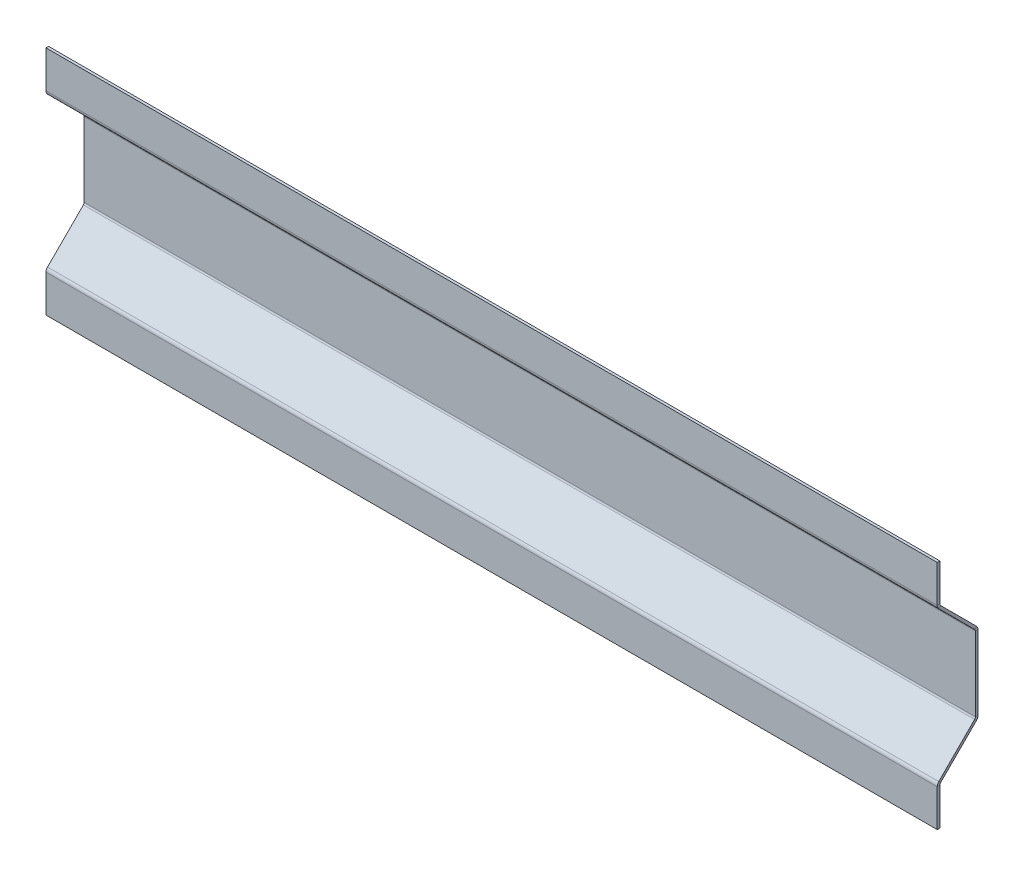
ISO-10303-21;
HEADER;
FILE_DESCRIPTION(('STEP AP214'),'2;1');
FILE_NAME('part.step','',(''),(''),'','','');
FILE_SCHEMA(('AUTOMOTIVE_DESIGN { 1 0 10303 214 1 1 1 1 }'));
ENDSEC;
DATA;
#1=APPLICATION_CONTEXT('core data for automotive mechanical design processes');
#2=APPLICATION_PROTOCOL_DEFINITION('international standard','automotive_design',2000,#1);
#3=PRODUCT_CONTEXT('',#1,'mechanical');
#4=PRODUCT('Part','Part','',(#3));
#5=PRODUCT_RELATED_PRODUCT_CATEGORY('part','',(#4));
#6=PRODUCT_DEFINITION_FORMATION('','',#4);
#7=PRODUCT_DEFINITION_CONTEXT('part definition',#1,'design');
#8=PRODUCT_DEFINITION('design','',#6,#7);
#9=PRODUCT_DEFINITION_SHAPE('','',#8);
#10=(LENGTH_UNIT() NAMED_UNIT(*) SI_UNIT(.MILLI.,.METRE.));
#11=(NAMED_UNIT(*) PLANE_ANGLE_UNIT() SI_UNIT($,.RADIAN.));
#12=(NAMED_UNIT(*) SI_UNIT($,.STERADIAN.) SOLID_ANGLE_UNIT());
#13=UNCERTAINTY_MEASURE_WITH_UNIT(LENGTH_MEASURE(1.E-05),#10,'distance_accuracy_value','');
#14=(GEOMETRIC_REPRESENTATION_CONTEXT(3) GLOBAL_UNCERTAINTY_ASSIGNED_CONTEXT((#13)) GLOBAL_UNIT_ASSIGNED_CONTEXT((#10,
#11,#12)) REPRESENTATION_CONTEXT('',''));
#15=CARTESIAN_POINT('',(0.,0.,0.));
#16=DIRECTION('',(0.,0.,1.));
#17=DIRECTION('',(1.,0.,0.));
#18=AXIS2_PLACEMENT_3D('',#15,#16,#17);
#19=CARTESIAN_POINT('',(170.,-30.5563491861041,14.556349186104));
#20=DIRECTION('',(-1.,0.,0.));
#21=DIRECTION('',(0.,0.,1.));
#22=AXIS2_PLACEMENT_3D('',#19,#20,#21);
#23=PLANE('',#22);
#24=DIRECTION('',(0.,0.707106781186544,0.707106781186551));
#25=VECTOR('',#24,1.);
#26=CARTESIAN_POINT('',(170.,-29.2634559672906,13.2634559672905));
#27=LINE('',#26,#25);
#28=CARTESIAN_POINT('',(170.,-29.2634559672906,13.2634559672905));
#29=VERTEX_POINT('',#28);
#30=CARTESIAN_POINT('',(170.,-28.5563491861041,13.9705627484771));
#31=VERTEX_POINT('',#30);
#32=EDGE_CURVE('E310',#29,#31,#27,.T.);
#33=ORIENTED_EDGE('',*,*,#32,.F.);
#34=DIRECTION('',(0.,-0.707106781186551,0.707106781186544));
#35=VECTOR('',#34,1.);
#36=CARTESIAN_POINT('',(170.,-7.29289321881336,-8.70710678118655));
#37=LINE('',#36,#35);
#38=CARTESIAN_POINT('',(170.,-15.5857864376269,-0.414213562373105));
#39=VERTEX_POINT('',#38);
#40=EDGE_CURVE('E412',#39,#29,#37,.T.);
#41=ORIENTED_EDGE('',*,*,#40,.F.);
#42=DIRECTION('',(0.,0.707106781186544,0.707106781186551));
#43=VECTOR('',#42,1.);
#44=CARTESIAN_POINT('',(170.,-14.8786796564403,0.292893218813448));
#45=LINE('',#44,#43);
#46=CARTESIAN_POINT('',(170.,-14.8786796564403,0.292893218813448));
#47=VERTEX_POINT('',#46);
#48=EDGE_CURVE('E423',#47,#39,#45,.F.);
#49=ORIENTED_EDGE('',*,*,#48,.F.);
#50=DIRECTION('',(0.,0.707106781186551,-0.707106781186544));
#51=VECTOR('',#50,1.);
#52=CARTESIAN_POINT('',(170.,-29.8492424049176,15.2634559672905));
#53=LINE('',#52,#51);
#54=EDGE_CURVE('E417',#47,#31,#53,.F.);
#55=ORIENTED_EDGE('',*,*,#54,.T.);
#56=EDGE_LOOP('',(#33,#41,#49,#55));
#57=FACE_BOUND('',#56,.T.);
#58=ADVANCED_FACE('F114',(#57),#23,.F.);
#59=CARTESIAN_POINT('',(-170.,-15.2928932188134,-0.707106781186551));
#60=DIRECTION('',(1.,0.,0.));
#61=DIRECTION('',(0.,0.,-1.));
#62=AXIS2_PLACEMENT_3D('',#59,#60,#61);
#63=PLANE('',#62);
#64=DIRECTION('',(0.,0.707106781186544,0.707106781186551));
#65=VECTOR('',#64,1.);
#66=CARTESIAN_POINT('',(-170.,-29.2634559672906,13.2634559672905));
#67=LINE('',#66,#65);
#68=CARTESIAN_POINT('',(-170.,-29.2634559672906,13.2634559672905));
#69=VERTEX_POINT('',#68);
#70=CARTESIAN_POINT('',(-170.,-28.5563491861041,13.9705627484771));
#71=VERTEX_POINT('',#70);
#72=EDGE_CURVE('E299',#69,#71,#67,.T.);
#73=ORIENTED_EDGE('',*,*,#72,.T.);
#74=DIRECTION('',(0.,-0.707106781186551,0.707106781186544));
#75=VECTOR('',#74,1.);
#76=CARTESIAN_POINT('',(-170.,-14.5857864376269,0.));
#77=LINE('',#76,#75);
#78=CARTESIAN_POINT('',(-170.,-14.8786796564403,0.292893218813448));
#79=VERTEX_POINT('',#78);
#80=EDGE_CURVE('E415',#71,#79,#77,.F.);
#81=ORIENTED_EDGE('',*,*,#80,.T.);
#82=DIRECTION('',(0.,0.707106781186544,0.707106781186551));
#83=VECTOR('',#82,1.);
#84=CARTESIAN_POINT('',(-170.,-15.5857864376269,-0.414213562373104));
#85=LINE('',#84,#83);
#86=CARTESIAN_POINT('',(-170.,-15.5857864376269,-0.414213562373103));
#87=VERTEX_POINT('',#86);
#88=EDGE_CURVE('E406',#79,#87,#85,.F.);
#89=ORIENTED_EDGE('',*,*,#88,.T.);
#90=DIRECTION('',(0.,0.707106781186551,-0.707106781186544));
#91=VECTOR('',#90,1.);
#92=CARTESIAN_POINT('',(-170.,-7.29289321881336,-8.70710678118655));
#93=LINE('',#92,#91);
#94=EDGE_CURVE('E409',#69,#87,#93,.T.);
#95=ORIENTED_EDGE('',*,*,#94,.F.);
#96=EDGE_LOOP('',(#73,#81,#89,#95));
#97=FACE_BOUND('',#96,.T.);
#98=ADVANCED_FACE('F533',(#97),#63,.F.);
#99=CARTESIAN_POINT('',(0.,-7.29289321881336,-8.70710678118655));
#100=DIRECTION('',(0.,0.707106781186544,0.707106781186551));
#101=DIRECTION('',(0.,-0.707106781186551,0.707106781186544));
#102=AXIS2_PLACEMENT_3D('',#99,#100,#101);
#103=PLANE('',#102);
#104=DIRECTION('',(-1.,0.,0.));
#105=VECTOR('',#104,1.);
#106=CARTESIAN_POINT('',(-170.,-29.2634559672906,13.2634559672905));
#107=LINE('',#106,#105);
#108=EDGE_CURVE('E305',#69,#29,#107,.F.);
#109=ORIENTED_EDGE('',*,*,#108,.F.);
#110=ORIENTED_EDGE('',*,*,#94,.T.);
#111=DIRECTION('',(1.,0.,0.));
#112=VECTOR('',#111,1.);
#113=CARTESIAN_POINT('',(-170.,-15.5857864376269,-0.414213562373104));
#114=LINE('',#113,#112);
#115=EDGE_CURVE('E420',#39,#87,#114,.F.);
#116=ORIENTED_EDGE('',*,*,#115,.F.);
#117=ORIENTED_EDGE('',*,*,#40,.T.);
#118=EDGE_LOOP('',(#109,#110,#116,#117));
#119=FACE_BOUND('',#118,.T.);
#120=ADVANCED_FACE('F487',(#119),#103,.F.);
#121=CARTESIAN_POINT('',(0.,-6.58578643762681,-8.));
#122=DIRECTION('',(0.,0.707106781186544,0.707106781186551));
#123=DIRECTION('',(0.,-0.707106781186551,0.707106781186544));
#124=AXIS2_PLACEMENT_3D('',#121,#122,#123);
#125=PLANE('',#124);
#126=ORIENTED_EDGE('',*,*,#80,.F.);
#127=DIRECTION('',(-1.,0.,0.));
#128=VECTOR('',#127,1.);
#129=CARTESIAN_POINT('',(-170.,-28.5563491861041,13.9705627484771));
#130=LINE('',#129,#128);
#131=EDGE_CURVE('E294',#71,#31,#130,.F.);
#132=ORIENTED_EDGE('',*,*,#131,.T.);
#133=ORIENTED_EDGE('',*,*,#54,.F.);
#134=DIRECTION('',(1.,0.,0.));
#135=VECTOR('',#134,1.);
#136=CARTESIAN_POINT('',(-170.,-14.8786796564403,0.292893218813448));
#137=LINE('',#136,#135);
#138=EDGE_CURVE('E426',#79,#47,#137,.T.);
#139=ORIENTED_EDGE('',*,*,#138,.F.);
#140=EDGE_LOOP('',(#126,#132,#133,#139));
#141=FACE_BOUND('',#140,.T.);
#142=ADVANCED_FACE('F477',(#141),#125,.T.);
#143=CARTESIAN_POINT('',(170.,15.2928932188134,-0.707106781186551));
#144=DIRECTION('',(-1.,0.,0.));
#145=DIRECTION('',(0.,0.,1.));
#146=AXIS2_PLACEMENT_3D('',#143,#144,#145);
#147=PLANE('',#146);
#148=DIRECTION('',(0.,-0.707106781186543,0.707106781186552));
#149=VECTOR('',#148,1.);
#150=CARTESIAN_POINT('',(170.,29.2634559672906,13.2634559672905));
#151=LINE('',#150,#149);
#152=CARTESIAN_POINT('',(170.,29.2634559672906,13.2634559672905));
#153=VERTEX_POINT('',#152);
#154=CARTESIAN_POINT('',(170.,28.5563491861041,13.9705627484771));
#155=VERTEX_POINT('',#154);
#156=EDGE_CURVE('E350',#153,#155,#151,.T.);
#157=ORIENTED_EDGE('',*,*,#156,.T.);
#158=DIRECTION('',(0.,0.707106781186551,0.707106781186544));
#159=VECTOR('',#158,1.);
#160=CARTESIAN_POINT('',(170.,14.5857864376269,0.));
#161=LINE('',#160,#159);
#162=CARTESIAN_POINT('',(170.,14.8786796564404,0.29289321881345));
#163=VERTEX_POINT('',#162);
#164=EDGE_CURVE('E374',#155,#163,#161,.F.);
#165=ORIENTED_EDGE('',*,*,#164,.T.);
#166=DIRECTION('',(0.,-0.707106781186544,0.707106781186551));
#167=VECTOR('',#166,1.);
#168=CARTESIAN_POINT('',(170.,15.5857864376269,-0.414213562373104));
#169=LINE('',#168,#167);
#170=CARTESIAN_POINT('',(170.,15.5857864376269,-0.414213562373102));
#171=VERTEX_POINT('',#170);
#172=EDGE_CURVE('E362',#163,#171,#169,.F.);
#173=ORIENTED_EDGE('',*,*,#172,.T.);
#174=DIRECTION('',(0.,-0.707106781186551,-0.707106781186544));
#175=VECTOR('',#174,1.);
#176=CARTESIAN_POINT('',(170.,7.29289321881336,-8.70710678118655));
#177=LINE('',#176,#175);
#178=EDGE_CURVE('E369',#153,#171,#177,.T.);
#179=ORIENTED_EDGE('',*,*,#178,.F.);
#180=EDGE_LOOP('',(#157,#165,#173,#179));
#181=FACE_BOUND('',#180,.T.);
#182=ADVANCED_FACE('F628',(#181),#147,.F.);
#183=CARTESIAN_POINT('',(-170.,30.5563491861041,14.556349186104));
#184=DIRECTION('',(1.,0.,0.));
#185=DIRECTION('',(0.,0.,-1.));
#186=AXIS2_PLACEMENT_3D('',#183,#184,#185);
#187=PLANE('',#186);
#188=DIRECTION('',(0.,-0.707106781186543,0.707106781186552));
#189=VECTOR('',#188,1.);
#190=CARTESIAN_POINT('',(-170.,29.2634559672906,13.2634559672905));
#191=LINE('',#190,#189);
#192=CARTESIAN_POINT('',(-170.,29.2634559672906,13.2634559672905));
#193=VERTEX_POINT('',#192);
#194=CARTESIAN_POINT('',(-170.,28.5563491861041,13.9705627484771));
#195=VERTEX_POINT('',#194);
#196=EDGE_CURVE('E360',#193,#195,#191,.T.);
#197=ORIENTED_EDGE('',*,*,#196,.F.);
#198=DIRECTION('',(0.,0.707106781186551,0.707106781186544));
#199=VECTOR('',#198,1.);
#200=CARTESIAN_POINT('',(-170.,7.29289321881336,-8.70710678118655));
#201=LINE('',#200,#199);
#202=CARTESIAN_POINT('',(-170.,15.5857864376269,-0.4142135623731));
#203=VERTEX_POINT('',#202);
#204=EDGE_CURVE('E365',#203,#193,#201,.T.);
#205=ORIENTED_EDGE('',*,*,#204,.F.);
#206=DIRECTION('',(0.,-0.707106781186544,0.707106781186551));
#207=VECTOR('',#206,1.);
#208=CARTESIAN_POINT('',(-170.,14.8786796564404,0.292893218813452));
#209=LINE('',#208,#207);
#210=CARTESIAN_POINT('',(-170.,14.8786796564404,0.29289321881345));
#211=VERTEX_POINT('',#210);
#212=EDGE_CURVE('E379',#211,#203,#209,.F.);
#213=ORIENTED_EDGE('',*,*,#212,.F.);
#214=DIRECTION('',(0.,-0.707106781186551,-0.707106781186544));
#215=VECTOR('',#214,1.);
#216=CARTESIAN_POINT('',(-170.,29.8492424049176,15.2634559672905));
#217=LINE('',#216,#215);
#218=EDGE_CURVE('E371',#211,#195,#217,.F.);
#219=ORIENTED_EDGE('',*,*,#218,.T.);
#220=EDGE_LOOP('',(#197,#205,#213,#219));
#221=FACE_BOUND('',#220,.T.);
#222=ADVANCED_FACE('F511',(#221),#187,.F.);
#223=CARTESIAN_POINT('',(0.,7.29289321881336,-8.70710678118655));
#224=DIRECTION('',(0.,-0.707106781186544,0.707106781186551));
#225=DIRECTION('',(0.,-0.707106781186551,-0.707106781186544));
#226=AXIS2_PLACEMENT_3D('',#223,#224,#225);
#227=PLANE('',#226);
#228=DIRECTION('',(1.,0.,0.));
#229=VECTOR('',#228,1.);
#230=CARTESIAN_POINT('',(170.,29.2634559672906,13.2634559672905));
#231=LINE('',#230,#229);
#232=EDGE_CURVE('E356',#153,#193,#231,.F.);
#233=ORIENTED_EDGE('',*,*,#232,.F.);
#234=ORIENTED_EDGE('',*,*,#178,.T.);
#235=DIRECTION('',(-1.,0.,0.));
#236=VECTOR('',#235,1.);
#237=CARTESIAN_POINT('',(170.,15.5857864376269,-0.414213562373104));
#238=LINE('',#237,#236);
#239=EDGE_CURVE('E376',#203,#171,#238,.F.);
#240=ORIENTED_EDGE('',*,*,#239,.F.);
#241=ORIENTED_EDGE('',*,*,#204,.T.);
#242=EDGE_LOOP('',(#233,#234,#240,#241));
#243=FACE_BOUND('',#242,.T.);
#244=ADVANCED_FACE('F518',(#243),#227,.F.);
#245=CARTESIAN_POINT('',(0.,6.58578643762681,-8.));
#246=DIRECTION('',(0.,-0.707106781186544,0.707106781186551));
#247=DIRECTION('',(0.,-0.707106781186551,-0.707106781186544));
#248=AXIS2_PLACEMENT_3D('',#245,#246,#247);
#249=PLANE('',#248);
#250=ORIENTED_EDGE('',*,*,#164,.F.);
#251=DIRECTION('',(1.,0.,0.));
#252=VECTOR('',#251,1.);
#253=CARTESIAN_POINT('',(170.,28.5563491861041,13.9705627484771));
#254=LINE('',#253,#252);
#255=EDGE_CURVE('E345',#155,#195,#254,.F.);
#256=ORIENTED_EDGE('',*,*,#255,.T.);
#257=ORIENTED_EDGE('',*,*,#218,.F.);
#258=DIRECTION('',(-1.,0.,0.));
#259=VECTOR('',#258,1.);
#260=CARTESIAN_POINT('',(170.,14.8786796564403,0.292893218813448));
#261=LINE('',#260,#259);
#262=EDGE_CURVE('E382',#163,#211,#261,.T.);
#263=ORIENTED_EDGE('',*,*,#262,.F.);
#264=EDGE_LOOP('',(#250,#256,#257,#263));
#265=FACE_BOUND('',#264,.T.);
#266=ADVANCED_FACE('F507',(#265),#249,.T.);
#267=CARTESIAN_POINT('',(0.,0.,-1.));
#268=DIRECTION('',(0.,0.,-1.));
#269=DIRECTION('',(-1.,0.,0.));
#270=AXIS2_PLACEMENT_3D('',#267,#268,#269);
#271=PLANE('',#270);
#272=DIRECTION('',(0.,-1.,0.));
#273=VECTOR('',#272,1.);
#274=CARTESIAN_POINT('',(-170.,-16.,-1.));
#275=LINE('',#274,#273);
#276=CARTESIAN_POINT('',(-170.,14.1715728752538,-0.999999999999999));
#277=VERTEX_POINT('',#276);
#278=CARTESIAN_POINT('',(-170.,-14.1715728752538,-1.));
#279=VERTEX_POINT('',#278);
#280=EDGE_CURVE('E13',#277,#279,#275,.T.);
#281=ORIENTED_EDGE('',*,*,#280,.F.);
#282=DIRECTION('',(-1.,0.,0.));
#283=VECTOR('',#282,1.);
#284=CARTESIAN_POINT('',(-170.,14.1715728752538,-0.999999999999999));
#285=LINE('',#284,#283);
#286=CARTESIAN_POINT('',(170.,14.1715728752538,-1.));
#287=VERTEX_POINT('',#286);
#288=EDGE_CURVE('E386',#277,#287,#285,.F.);
#289=ORIENTED_EDGE('',*,*,#288,.T.);
#290=DIRECTION('',(0.,1.,0.));
#291=VECTOR('',#290,1.);
#292=CARTESIAN_POINT('',(170.,-16.,-1.));
#293=LINE('',#292,#291);
#294=CARTESIAN_POINT('',(170.,-14.1715728752538,-1.));
#295=VERTEX_POINT('',#294);
#296=EDGE_CURVE('E123',#295,#287,#293,.T.);
#297=ORIENTED_EDGE('',*,*,#296,.F.);
#298=DIRECTION('',(1.,0.,0.));
#299=VECTOR('',#298,1.);
#300=CARTESIAN_POINT('',(170.,-14.1715728752538,-1.));
#301=LINE('',#300,#299);
#302=EDGE_CURVE('E430',#295,#279,#301,.F.);
#303=ORIENTED_EDGE('',*,*,#302,.T.);
#304=EDGE_LOOP('',(#281,#289,#297,#303));
#305=FACE_BOUND('',#304,.T.);
#306=ADVANCED_FACE('F493',(#305),#271,.T.);
#307=CARTESIAN_POINT('',(0.,0.,0.));
#308=DIRECTION('',(0.,0.,-1.));
#309=DIRECTION('',(-1.,0.,0.));
#310=AXIS2_PLACEMENT_3D('',#307,#308,#309);
#311=PLANE('',#310);
#312=DIRECTION('',(-1.,0.,0.));
#313=VECTOR('',#312,1.);
#314=CARTESIAN_POINT('',(-170.,14.1715728752538,0.));
#315=LINE('',#314,#313);
#316=CARTESIAN_POINT('',(-170.,14.1715728752538,0.));
#317=VERTEX_POINT('',#316);
#318=CARTESIAN_POINT('',(170.,14.1715728752538,0.));
#319=VERTEX_POINT('',#318);
#320=EDGE_CURVE('E399',#317,#319,#315,.F.);
#321=ORIENTED_EDGE('',*,*,#320,.F.);
#322=DIRECTION('',(0.,-1.,0.));
#323=VECTOR('',#322,1.);
#324=CARTESIAN_POINT('',(-170.,-16.,0.));
#325=LINE('',#324,#323);
#326=CARTESIAN_POINT('',(-170.,-14.1715728752538,0.));
#327=VERTEX_POINT('',#326);
#328=EDGE_CURVE('E118',#317,#327,#325,.T.);
#329=ORIENTED_EDGE('',*,*,#328,.T.);
#330=DIRECTION('',(1.,0.,0.));
#331=VECTOR('',#330,1.);
#332=CARTESIAN_POINT('',(170.,-14.1715728752538,0.));
#333=LINE('',#332,#331);
#334=CARTESIAN_POINT('',(170.,-14.1715728752538,0.));
#335=VERTEX_POINT('',#334);
#336=EDGE_CURVE('E443',#335,#327,#333,.F.);
#337=ORIENTED_EDGE('',*,*,#336,.F.);
#338=DIRECTION('',(0.,1.,0.));
#339=VECTOR('',#338,1.);
#340=CARTESIAN_POINT('',(170.,-16.,0.));
#341=LINE('',#340,#339);
#342=EDGE_CURVE('E450',#335,#319,#341,.T.);
#343=ORIENTED_EDGE('',*,*,#342,.T.);
#344=EDGE_LOOP('',(#321,#329,#337,#343));
#345=FACE_BOUND('',#344,.T.);
#346=ADVANCED_FACE('F462',(#345),#311,.F.);
#347=CARTESIAN_POINT('',(-170.,-16.,-1.));
#348=DIRECTION('',(-1.,0.,0.));
#349=DIRECTION('',(0.,0.,1.));
#350=AXIS2_PLACEMENT_3D('',#347,#348,#349);
#351=PLANE('',#350);
#352=ORIENTED_EDGE('',*,*,#328,.F.);
#353=DIRECTION('',(0.,0.,-1.));
#354=VECTOR('',#353,1.);
#355=CARTESIAN_POINT('',(-170.,14.1715728752538,0.));
#356=LINE('',#355,#354);
#357=EDGE_CURVE('E393',#317,#277,#356,.T.);
#358=ORIENTED_EDGE('',*,*,#357,.T.);
#359=ORIENTED_EDGE('',*,*,#280,.T.);
#360=DIRECTION('',(0.,0.,-1.));
#361=VECTOR('',#360,1.);
#362=CARTESIAN_POINT('',(-170.,-14.1715728752538,0.));
#363=LINE('',#362,#361);
#364=EDGE_CURVE('E447',#327,#279,#363,.T.);
#365=ORIENTED_EDGE('',*,*,#364,.F.);
#366=EDGE_LOOP('',(#352,#358,#359,#365));
#367=FACE_BOUND('',#366,.T.);
#368=ADVANCED_FACE('F464',(#367),#351,.T.);
#369=CARTESIAN_POINT('',(170.,-16.,-1.));
#370=DIRECTION('',(1.,0.,0.));
#371=DIRECTION('',(0.,0.,-1.));
#372=AXIS2_PLACEMENT_3D('',#369,#370,#371);
#373=PLANE('',#372);
#374=DIRECTION('',(0.,0.,-1.));
#375=VECTOR('',#374,1.);
#376=CARTESIAN_POINT('',(170.,14.1715728752538,0.));
#377=LINE('',#376,#375);
#378=EDGE_CURVE('E403',#319,#287,#377,.T.);
#379=ORIENTED_EDGE('',*,*,#378,.F.);
#380=ORIENTED_EDGE('',*,*,#342,.F.);
#381=DIRECTION('',(0.,0.,-1.));
#382=VECTOR('',#381,1.);
#383=CARTESIAN_POINT('',(170.,-14.1715728752538,0.));
#384=LINE('',#383,#382);
#385=EDGE_CURVE('E437',#335,#295,#384,.T.);
#386=ORIENTED_EDGE('',*,*,#385,.T.);
#387=ORIENTED_EDGE('',*,*,#296,.T.);
#388=EDGE_LOOP('',(#379,#380,#386,#387));
#389=FACE_BOUND('',#388,.T.);
#390=ADVANCED_FACE('F116',(#389),#373,.T.);
#391=CARTESIAN_POINT('',(-170.,-14.1715728752538,0.999999999999998));
#392=DIRECTION('',(-1.,0.,0.));
#393=DIRECTION('',(0.,0.,1.));
#394=AXIS2_PLACEMENT_3D('',#391,#392,#393);
#395=PLANE('',#394);
#396=ORIENTED_EDGE('',*,*,#88,.F.);
#397=CARTESIAN_POINT('',(-170.,-14.1715728752538,0.999999999999998));
#398=DIRECTION('',(1.,0.,0.));
#399=DIRECTION('',(0.,0.,-1.));
#400=AXIS2_PLACEMENT_3D('',#397,#398,#399);
#401=CIRCLE('',#400,0.999999999999999);
#402=EDGE_CURVE('E440',#327,#79,#401,.F.);
#403=ORIENTED_EDGE('',*,*,#402,.F.);
#404=ORIENTED_EDGE('',*,*,#364,.T.);
#405=CARTESIAN_POINT('',(-170.,-14.1715728752538,0.999999999999998));
#406=DIRECTION('',(1.,0.,0.));
#407=DIRECTION('',(0.,0.,-1.));
#408=AXIS2_PLACEMENT_3D('',#405,#406,#407);
#409=CIRCLE('',#408,2.);
#410=EDGE_CURVE('E433',#279,#87,#409,.F.);
#411=ORIENTED_EDGE('',*,*,#410,.T.);
#412=EDGE_LOOP('',(#396,#403,#404,#411));
#413=FACE_BOUND('',#412,.T.);
#414=ADVANCED_FACE('F469',(#413),#395,.T.);
#415=CARTESIAN_POINT('',(170.,-14.1715728752538,0.999999999999998));
#416=DIRECTION('',(-1.,0.,0.));
#417=DIRECTION('',(0.,0.,1.));
#418=AXIS2_PLACEMENT_3D('',#415,#416,#417);
#419=PLANE('',#418);
#420=CARTESIAN_POINT('',(170.,-14.1715728752538,0.999999999999998));
#421=DIRECTION('',(1.,0.,0.));
#422=DIRECTION('',(0.,0.,-1.));
#423=AXIS2_PLACEMENT_3D('',#420,#421,#422);
#424=CIRCLE('',#423,0.999999999999999);
#425=EDGE_CURVE('E411',#47,#335,#424,.T.);
#426=ORIENTED_EDGE('',*,*,#425,.F.);
#427=ORIENTED_EDGE('',*,*,#48,.T.);
#428=CARTESIAN_POINT('',(170.,-14.1715728752538,0.999999999999998));
#429=DIRECTION('',(1.,0.,0.));
#430=DIRECTION('',(0.,0.,-1.));
#431=AXIS2_PLACEMENT_3D('',#428,#429,#430);
#432=CIRCLE('',#431,2.);
#433=EDGE_CURVE('E434',#39,#295,#432,.T.);
#434=ORIENTED_EDGE('',*,*,#433,.T.);
#435=ORIENTED_EDGE('',*,*,#385,.F.);
#436=EDGE_LOOP('',(#426,#427,#434,#435));
#437=FACE_BOUND('',#436,.T.);
#438=ADVANCED_FACE('F484',(#437),#419,.F.);
#439=CARTESIAN_POINT('',(170.,-14.1715728752538,0.999999999999998));
#440=DIRECTION('',(1.,0.,0.));
#441=DIRECTION('',(0.,-0.707106781186544,-0.707106781186551));
#442=AXIS2_PLACEMENT_3D('',#439,#440,#441);
#443=CYLINDRICAL_SURFACE('',#442,2.);
#444=ORIENTED_EDGE('',*,*,#302,.F.);
#445=ORIENTED_EDGE('',*,*,#433,.F.);
#446=ORIENTED_EDGE('',*,*,#115,.T.);
#447=ORIENTED_EDGE('',*,*,#410,.F.);
#448=EDGE_LOOP('',(#444,#445,#446,#447));
#449=FACE_BOUND('',#448,.T.);
#450=ADVANCED_FACE('F490',(#449),#443,.T.);
#451=CARTESIAN_POINT('',(170.,-14.1715728752538,0.999999999999998));
#452=DIRECTION('',(1.,0.,0.));
#453=DIRECTION('',(0.,-0.707106781186544,-0.707106781186551));
#454=AXIS2_PLACEMENT_3D('',#451,#452,#453);
#455=CYLINDRICAL_SURFACE('',#454,0.999999999999999);
#456=ORIENTED_EDGE('',*,*,#336,.T.);
#457=ORIENTED_EDGE('',*,*,#402,.T.);
#458=ORIENTED_EDGE('',*,*,#138,.T.);
#459=ORIENTED_EDGE('',*,*,#425,.T.);
#460=EDGE_LOOP('',(#456,#457,#458,#459));
#461=FACE_BOUND('',#460,.T.);
#462=ADVANCED_FACE('F472',(#461),#455,.F.);
#463=CARTESIAN_POINT('',(170.,14.1715728752538,1.));
#464=DIRECTION('',(1.,0.,0.));
#465=DIRECTION('',(0.,0.,-1.));
#466=AXIS2_PLACEMENT_3D('',#463,#464,#465);
#467=PLANE('',#466);
#468=ORIENTED_EDGE('',*,*,#172,.F.);
#469=CARTESIAN_POINT('',(170.,14.1715728752538,1.));
#470=DIRECTION('',(-1.,0.,0.));
#471=DIRECTION('',(0.,0.,1.));
#472=AXIS2_PLACEMENT_3D('',#469,#470,#471);
#473=CIRCLE('',#472,0.999999999999999);
#474=EDGE_CURVE('E396',#319,#163,#473,.F.);
#475=ORIENTED_EDGE('',*,*,#474,.F.);
#476=ORIENTED_EDGE('',*,*,#378,.T.);
#477=CARTESIAN_POINT('',(170.,14.1715728752538,1.));
#478=DIRECTION('',(-1.,0.,0.));
#479=DIRECTION('',(0.,0.,1.));
#480=AXIS2_PLACEMENT_3D('',#477,#478,#479);
#481=CIRCLE('',#480,2.);
#482=EDGE_CURVE('E389',#287,#171,#481,.F.);
#483=ORIENTED_EDGE('',*,*,#482,.T.);
#484=EDGE_LOOP('',(#468,#475,#476,#483));
#485=FACE_BOUND('',#484,.T.);
#486=ADVANCED_FACE('F499',(#485),#467,.T.);
#487=CARTESIAN_POINT('',(-170.,14.1715728752538,1.));
#488=DIRECTION('',(1.,0.,0.));
#489=DIRECTION('',(0.,0.,-1.));
#490=AXIS2_PLACEMENT_3D('',#487,#488,#489);
#491=PLANE('',#490);
#492=CARTESIAN_POINT('',(-170.,14.1715728752538,1.));
#493=DIRECTION('',(-1.,0.,0.));
#494=DIRECTION('',(0.,0.,1.));
#495=AXIS2_PLACEMENT_3D('',#492,#493,#494);
#496=CIRCLE('',#495,0.999999999999999);
#497=EDGE_CURVE('E368',#211,#317,#496,.T.);
#498=ORIENTED_EDGE('',*,*,#497,.F.);
#499=ORIENTED_EDGE('',*,*,#212,.T.);
#500=CARTESIAN_POINT('',(-170.,14.1715728752538,1.));
#501=DIRECTION('',(-1.,0.,0.));
#502=DIRECTION('',(0.,0.,1.));
#503=AXIS2_PLACEMENT_3D('',#500,#501,#502);
#504=CIRCLE('',#503,2.);
#505=EDGE_CURVE('E390',#203,#277,#504,.T.);
#506=ORIENTED_EDGE('',*,*,#505,.T.);
#507=ORIENTED_EDGE('',*,*,#357,.F.);
#508=EDGE_LOOP('',(#498,#499,#506,#507));
#509=FACE_BOUND('',#508,.T.);
#510=ADVANCED_FACE('F515',(#509),#491,.F.);
#511=CARTESIAN_POINT('',(-170.,14.1715728752538,1.));
#512=DIRECTION('',(-1.,0.,0.));
#513=DIRECTION('',(0.,0.707106781186544,-0.707106781186551));
#514=AXIS2_PLACEMENT_3D('',#511,#512,#513);
#515=CYLINDRICAL_SURFACE('',#514,2.);
#516=ORIENTED_EDGE('',*,*,#288,.F.);
#517=ORIENTED_EDGE('',*,*,#505,.F.);
#518=ORIENTED_EDGE('',*,*,#239,.T.);
#519=ORIENTED_EDGE('',*,*,#482,.F.);
#520=EDGE_LOOP('',(#516,#517,#518,#519));
#521=FACE_BOUND('',#520,.T.);
#522=ADVANCED_FACE('F521',(#521),#515,.T.);
#523=CARTESIAN_POINT('',(-170.,14.1715728752538,1.));
#524=DIRECTION('',(-1.,0.,0.));
#525=DIRECTION('',(0.,0.707106781186544,-0.707106781186551));
#526=AXIS2_PLACEMENT_3D('',#523,#524,#525);
#527=CYLINDRICAL_SURFACE('',#526,0.999999999999999);
#528=ORIENTED_EDGE('',*,*,#320,.T.);
#529=ORIENTED_EDGE('',*,*,#474,.T.);
#530=ORIENTED_EDGE('',*,*,#262,.T.);
#531=ORIENTED_EDGE('',*,*,#497,.T.);
#532=EDGE_LOOP('',(#528,#529,#530,#531));
#533=FACE_BOUND('',#532,.T.);
#534=ADVANCED_FACE('F502',(#533),#527,.F.);
#535=CARTESIAN_POINT('',(-170.,29.9705627484772,12.556349186104));
#536=DIRECTION('',(-1.,0.,0.));
#537=DIRECTION('',(0.,0.,1.));
#538=AXIS2_PLACEMENT_3D('',#535,#536,#537);
#539=PLANE('',#538);
#540=DIRECTION('',(0.,0.,-1.));
#541=VECTOR('',#540,1.);
#542=CARTESIAN_POINT('',(-170.,29.9705627484772,14.556349186104));
#543=LINE('',#542,#541);
#544=CARTESIAN_POINT('',(-170.,29.9705627484772,13.556349186104));
#545=VERTEX_POINT('',#544);
#546=CARTESIAN_POINT('',(-170.,29.9705627484772,14.556349186104));
#547=VERTEX_POINT('',#546);
#548=EDGE_CURVE('E312',#545,#547,#543,.F.);
#549=ORIENTED_EDGE('',*,*,#548,.F.);
#550=CARTESIAN_POINT('',(-170.,29.9705627484772,12.556349186104));
#551=DIRECTION('',(1.,0.,0.));
#552=DIRECTION('',(0.,0.,-1.));
#553=AXIS2_PLACEMENT_3D('',#550,#551,#552);
#554=CIRCLE('',#553,0.999999999999997);
#555=EDGE_CURVE('E353',#193,#545,#554,.F.);
#556=ORIENTED_EDGE('',*,*,#555,.F.);
#557=ORIENTED_EDGE('',*,*,#196,.T.);
#558=CARTESIAN_POINT('',(-170.,29.9705627484772,12.556349186104));
#559=DIRECTION('',(1.,0.,0.));
#560=DIRECTION('',(0.,0.,-1.));
#561=AXIS2_PLACEMENT_3D('',#558,#559,#560);
#562=CIRCLE('',#561,2.);
#563=EDGE_CURVE('E139',#195,#547,#562,.F.);
#564=ORIENTED_EDGE('',*,*,#563,.T.);
#565=EDGE_LOOP('',(#549,#556,#557,#564));
#566=FACE_BOUND('',#565,.T.);
#567=ADVANCED_FACE('F528',(#566),#539,.T.);
#568=CARTESIAN_POINT('',(170.,29.9705627484772,12.556349186104));
#569=DIRECTION('',(-1.,0.,0.));
#570=DIRECTION('',(0.,0.,1.));
#571=AXIS2_PLACEMENT_3D('',#568,#569,#570);
#572=PLANE('',#571);
#573=CARTESIAN_POINT('',(170.,29.9705627484772,12.556349186104));
#574=DIRECTION('',(1.,0.,0.));
#575=DIRECTION('',(0.,0.,-1.));
#576=AXIS2_PLACEMENT_3D('',#573,#574,#575);
#577=CIRCLE('',#576,0.999999999999997);
#578=CARTESIAN_POINT('',(170.,29.9705627484772,13.556349186104));
#579=VERTEX_POINT('',#578);
#580=EDGE_CURVE('E318',#579,#153,#577,.T.);
#581=ORIENTED_EDGE('',*,*,#580,.F.);
#582=DIRECTION('',(0.,0.,-1.));
#583=VECTOR('',#582,1.);
#584=CARTESIAN_POINT('',(170.,29.9705627484772,13.556349186104));
#585=LINE('',#584,#583);
#586=CARTESIAN_POINT('',(170.,29.9705627484772,14.556349186104));
#587=VERTEX_POINT('',#586);
#588=EDGE_CURVE('E338',#579,#587,#585,.F.);
#589=ORIENTED_EDGE('',*,*,#588,.T.);
#590=CARTESIAN_POINT('',(170.,29.9705627484772,12.556349186104));
#591=DIRECTION('',(1.,0.,0.));
#592=DIRECTION('',(0.,0.,-1.));
#593=AXIS2_PLACEMENT_3D('',#590,#591,#592);
#594=CIRCLE('',#593,2.);
#595=EDGE_CURVE('E348',#587,#155,#594,.T.);
#596=ORIENTED_EDGE('',*,*,#595,.T.);
#597=ORIENTED_EDGE('',*,*,#156,.F.);
#598=EDGE_LOOP('',(#581,#589,#596,#597));
#599=FACE_BOUND('',#598,.T.);
#600=ADVANCED_FACE('F666',(#599),#572,.F.);
#601=CARTESIAN_POINT('',(170.,29.9705627484772,12.556349186104));
#602=DIRECTION('',(1.,0.,0.));
#603=DIRECTION('',(0.,0.,1.));
#604=AXIS2_PLACEMENT_3D('',#601,#602,#603);
#605=CYLINDRICAL_SURFACE('',#604,2.);
#606=ORIENTED_EDGE('',*,*,#255,.F.);
#607=ORIENTED_EDGE('',*,*,#595,.F.);
#608=DIRECTION('',(1.,0.,0.));
#609=VECTOR('',#608,1.);
#610=CARTESIAN_POINT('',(-170.,29.9705627484772,14.556349186104));
#611=LINE('',#610,#609);
#612=EDGE_CURVE('E336',#587,#547,#611,.F.);
#613=ORIENTED_EDGE('',*,*,#612,.T.);
#614=ORIENTED_EDGE('',*,*,#563,.F.);
#615=EDGE_LOOP('',(#606,#607,#613,#614));
#616=FACE_BOUND('',#615,.T.);
#617=ADVANCED_FACE('F676',(#616),#605,.T.);
#618=CARTESIAN_POINT('',(170.,29.9705627484772,12.556349186104));
#619=DIRECTION('',(1.,0.,0.));
#620=DIRECTION('',(0.,0.,1.));
#621=AXIS2_PLACEMENT_3D('',#618,#619,#620);
#622=CYLINDRICAL_SURFACE('',#621,0.999999999999997);
#623=ORIENTED_EDGE('',*,*,#232,.T.);
#624=ORIENTED_EDGE('',*,*,#555,.T.);
#625=DIRECTION('',(1.,0.,0.));
#626=VECTOR('',#625,1.);
#627=CARTESIAN_POINT('',(-170.,29.9705627484772,13.556349186104));
#628=LINE('',#627,#626);
#629=EDGE_CURVE('E341',#545,#579,#628,.T.);
#630=ORIENTED_EDGE('',*,*,#629,.T.);
#631=ORIENTED_EDGE('',*,*,#580,.T.);
#632=EDGE_LOOP('',(#623,#624,#630,#631));
#633=FACE_BOUND('',#632,.T.);
#634=ADVANCED_FACE('F687',(#633),#622,.F.);
#635=CARTESIAN_POINT('',(170.,44.142135623731,14.556349186104));
#636=DIRECTION('',(-1.,0.,0.));
#637=DIRECTION('',(0.,0.,1.));
#638=AXIS2_PLACEMENT_3D('',#635,#636,#637);
#639=PLANE('',#638);
#640=ORIENTED_EDGE('',*,*,#588,.F.);
#641=DIRECTION('',(0.,-1.,0.));
#642=VECTOR('',#641,1.);
#643=CARTESIAN_POINT('',(170.,44.142135623731,13.556349186104));
#644=LINE('',#643,#642);
#645=CARTESIAN_POINT('',(170.,44.142135623731,13.556349186104));
#646=VERTEX_POINT('',#645);
#647=EDGE_CURVE('E334',#579,#646,#644,.F.);
#648=ORIENTED_EDGE('',*,*,#647,.T.);
#649=DIRECTION('',(0.,0.,-1.));
#650=VECTOR('',#649,1.);
#651=CARTESIAN_POINT('',(170.,44.142135623731,14.556349186104));
#652=LINE('',#651,#650);
#653=CARTESIAN_POINT('',(170.,44.142135623731,14.556349186104));
#654=VERTEX_POINT('',#653);
#655=EDGE_CURVE('E315',#654,#646,#652,.T.);
#656=ORIENTED_EDGE('',*,*,#655,.F.);
#657=DIRECTION('',(0.,1.,0.));
#658=VECTOR('',#657,1.);
#659=CARTESIAN_POINT('',(170.,-1.00000000000001,14.556349186104));
#660=LINE('',#659,#658);
#661=EDGE_CURVE('E327',#587,#654,#660,.T.);
#662=ORIENTED_EDGE('',*,*,#661,.F.);
#663=EDGE_LOOP('',(#640,#648,#656,#662));
#664=FACE_BOUND('',#663,.T.);
#665=ADVANCED_FACE('F697',(#664),#639,.F.);
#666=CARTESIAN_POINT('',(-170.,29.5563491861041,14.556349186104));
#667=DIRECTION('',(1.,0.,0.));
#668=DIRECTION('',(0.,0.,-1.));
#669=AXIS2_PLACEMENT_3D('',#666,#667,#668);
#670=PLANE('',#669);
#671=ORIENTED_EDGE('',*,*,#548,.T.);
#672=DIRECTION('',(0.,-1.,0.));
#673=VECTOR('',#672,1.);
#674=CARTESIAN_POINT('',(-170.,-1.00000000000001,14.556349186104));
#675=LINE('',#674,#673);
#676=CARTESIAN_POINT('',(-170.,44.142135623731,14.556349186104));
#677=VERTEX_POINT('',#676);
#678=EDGE_CURVE('E322',#677,#547,#675,.T.);
#679=ORIENTED_EDGE('',*,*,#678,.F.);
#680=DIRECTION('',(0.,0.,-1.));
#681=VECTOR('',#680,1.);
#682=CARTESIAN_POINT('',(-170.,44.142135623731,14.556349186104));
#683=LINE('',#682,#681);
#684=CARTESIAN_POINT('',(-170.,44.142135623731,13.556349186104));
#685=VERTEX_POINT('',#684);
#686=EDGE_CURVE('E319',#677,#685,#683,.T.);
#687=ORIENTED_EDGE('',*,*,#686,.T.);
#688=DIRECTION('',(0.,1.,0.));
#689=VECTOR('',#688,1.);
#690=CARTESIAN_POINT('',(-170.,29.5563491861041,13.556349186104));
#691=LINE('',#690,#689);
#692=EDGE_CURVE('E329',#685,#545,#691,.F.);
#693=ORIENTED_EDGE('',*,*,#692,.T.);
#694=EDGE_LOOP('',(#671,#679,#687,#693));
#695=FACE_BOUND('',#694,.T.);
#696=ADVANCED_FACE('F708',(#695),#670,.F.);
#697=CARTESIAN_POINT('',(0.,-1.00000000000001,14.556349186104));
#698=DIRECTION('',(0.,0.,-1.));
#699=DIRECTION('',(-1.,0.,0.));
#700=AXIS2_PLACEMENT_3D('',#697,#698,#699);
#701=PLANE('',#700);
#702=ORIENTED_EDGE('',*,*,#612,.F.);
#703=ORIENTED_EDGE('',*,*,#661,.T.);
#704=DIRECTION('',(-1.,0.,0.));
#705=VECTOR('',#704,1.);
#706=CARTESIAN_POINT('',(0.,44.142135623731,14.556349186104));
#707=LINE('',#706,#705);
#708=EDGE_CURVE('E325',#654,#677,#707,.T.);
#709=ORIENTED_EDGE('',*,*,#708,.T.);
#710=ORIENTED_EDGE('',*,*,#678,.T.);
#711=EDGE_LOOP('',(#702,#703,#709,#710));
#712=FACE_BOUND('',#711,.T.);
#713=ADVANCED_FACE('F719',(#712),#701,.F.);
#714=CARTESIAN_POINT('',(0.,-1.00000000000001,13.556349186104));
#715=DIRECTION('',(0.,0.,-1.));
#716=DIRECTION('',(-1.,0.,0.));
#717=AXIS2_PLACEMENT_3D('',#714,#715,#716);
#718=PLANE('',#717);
#719=ORIENTED_EDGE('',*,*,#647,.F.);
#720=ORIENTED_EDGE('',*,*,#629,.F.);
#721=ORIENTED_EDGE('',*,*,#692,.F.);
#722=DIRECTION('',(1.,0.,0.));
#723=VECTOR('',#722,1.);
#724=CARTESIAN_POINT('',(-170.,44.142135623731,13.556349186104));
#725=LINE('',#724,#723);
#726=EDGE_CURVE('E332',#646,#685,#725,.F.);
#727=ORIENTED_EDGE('',*,*,#726,.F.);
#728=EDGE_LOOP('',(#719,#720,#721,#727));
#729=FACE_BOUND('',#728,.T.);
#730=ADVANCED_FACE('F730',(#729),#718,.T.);
#731=CARTESIAN_POINT('',(-170.,44.142135623731,14.556349186104));
#732=DIRECTION('',(0.,-1.,0.));
#733=DIRECTION('',(0.,0.,-1.));
#734=AXIS2_PLACEMENT_3D('',#731,#732,#733);
#735=PLANE('',#734);
#736=ORIENTED_EDGE('',*,*,#726,.T.);
#737=ORIENTED_EDGE('',*,*,#686,.F.);
#738=ORIENTED_EDGE('',*,*,#708,.F.);
#739=ORIENTED_EDGE('',*,*,#655,.T.);
#740=EDGE_LOOP('',(#736,#737,#738,#739));
#741=FACE_BOUND('',#740,.T.);
#742=ADVANCED_FACE('F741',(#741),#735,.F.);
#743=CARTESIAN_POINT('',(170.,-29.9705627484772,12.556349186104));
#744=DIRECTION('',(1.,0.,0.));
#745=DIRECTION('',(0.,0.,-1.));
#746=AXIS2_PLACEMENT_3D('',#743,#744,#745);
#747=PLANE('',#746);
#748=DIRECTION('',(0.,0.,-1.));
#749=VECTOR('',#748,1.);
#750=CARTESIAN_POINT('',(170.,-29.9705627484772,14.556349186104));
#751=LINE('',#750,#749);
#752=CARTESIAN_POINT('',(170.,-29.9705627484772,13.556349186104));
#753=VERTEX_POINT('',#752);
#754=CARTESIAN_POINT('',(170.,-29.9705627484772,14.556349186104));
#755=VERTEX_POINT('',#754);
#756=EDGE_CURVE('E277',#753,#755,#751,.F.);
#757=ORIENTED_EDGE('',*,*,#756,.F.);
#758=CARTESIAN_POINT('',(170.,-29.9705627484772,12.556349186104));
#759=DIRECTION('',(-1.,0.,0.));
#760=DIRECTION('',(0.,0.,1.));
#761=AXIS2_PLACEMENT_3D('',#758,#759,#760);
#762=CIRCLE('',#761,0.999999999999997);
#763=EDGE_CURVE('E302',#29,#753,#762,.F.);
#764=ORIENTED_EDGE('',*,*,#763,.F.);
#765=ORIENTED_EDGE('',*,*,#32,.T.);
#766=CARTESIAN_POINT('',(170.,-29.9705627484772,12.556349186104));
#767=DIRECTION('',(-1.,0.,0.));
#768=DIRECTION('',(0.,0.,1.));
#769=AXIS2_PLACEMENT_3D('',#766,#767,#768);
#770=CIRCLE('',#769,2.);
#771=EDGE_CURVE('E131',#31,#755,#770,.F.);
#772=ORIENTED_EDGE('',*,*,#771,.T.);
#773=EDGE_LOOP('',(#757,#764,#765,#772));
#774=FACE_BOUND('',#773,.T.);
#775=ADVANCED_FACE('F752',(#774),#747,.T.);
#776=CARTESIAN_POINT('',(-170.,-29.9705627484772,12.556349186104));
#777=DIRECTION('',(1.,0.,0.));
#778=DIRECTION('',(0.,0.,-1.));
#779=AXIS2_PLACEMENT_3D('',#776,#777,#778);
#780=PLANE('',#779);
#781=CARTESIAN_POINT('',(-170.,-29.9705627484772,12.556349186104));
#782=DIRECTION('',(-1.,0.,0.));
#783=DIRECTION('',(0.,0.,1.));
#784=AXIS2_PLACEMENT_3D('',#781,#782,#783);
#785=CIRCLE('',#784,0.999999999999997);
#786=CARTESIAN_POINT('',(-170.,-29.9705627484772,13.556349186104));
#787=VERTEX_POINT('',#786);
#788=EDGE_CURVE('E307',#787,#69,#785,.T.);
#789=ORIENTED_EDGE('',*,*,#788,.F.);
#790=DIRECTION('',(0.,0.,-1.));
#791=VECTOR('',#790,1.);
#792=CARTESIAN_POINT('',(-170.,-29.9705627484772,13.556349186104));
#793=LINE('',#792,#791);
#794=CARTESIAN_POINT('',(-170.,-29.9705627484772,14.556349186104));
#795=VERTEX_POINT('',#794);
#796=EDGE_CURVE('E288',#787,#795,#793,.F.);
#797=ORIENTED_EDGE('',*,*,#796,.T.);
#798=CARTESIAN_POINT('',(-170.,-29.9705627484772,12.556349186104));
#799=DIRECTION('',(-1.,0.,0.));
#800=DIRECTION('',(0.,0.,1.));
#801=AXIS2_PLACEMENT_3D('',#798,#799,#800);
#802=CIRCLE('',#801,2.);
#803=EDGE_CURVE('E297',#795,#71,#802,.T.);
#804=ORIENTED_EDGE('',*,*,#803,.T.);
#805=ORIENTED_EDGE('',*,*,#72,.F.);
#806=EDGE_LOOP('',(#789,#797,#804,#805));
#807=FACE_BOUND('',#806,.T.);
#808=ADVANCED_FACE('F763',(#807),#780,.F.);
#809=CARTESIAN_POINT('',(-170.,-29.9705627484772,12.556349186104));
#810=DIRECTION('',(-1.,0.,0.));
#811=DIRECTION('',(0.,0.,1.));
#812=AXIS2_PLACEMENT_3D('',#809,#810,#811);
#813=CYLINDRICAL_SURFACE('',#812,2.);
#814=ORIENTED_EDGE('',*,*,#131,.F.);
#815=ORIENTED_EDGE('',*,*,#803,.F.);
#816=DIRECTION('',(-1.,0.,0.));
#817=VECTOR('',#816,1.);
#818=CARTESIAN_POINT('',(170.,-29.9705627484772,14.556349186104));
#819=LINE('',#818,#817);
#820=EDGE_CURVE('E286',#795,#755,#819,.F.);
#821=ORIENTED_EDGE('',*,*,#820,.T.);
#822=ORIENTED_EDGE('',*,*,#771,.F.);
#823=EDGE_LOOP('',(#814,#815,#821,#822));
#824=FACE_BOUND('',#823,.T.);
#825=ADVANCED_FACE('F774',(#824),#813,.T.);
#826=CARTESIAN_POINT('',(-170.,-29.9705627484772,12.556349186104));
#827=DIRECTION('',(-1.,0.,0.));
#828=DIRECTION('',(0.,0.,1.));
#829=AXIS2_PLACEMENT_3D('',#826,#827,#828);
#830=CYLINDRICAL_SURFACE('',#829,0.999999999999997);
#831=ORIENTED_EDGE('',*,*,#108,.T.);
#832=ORIENTED_EDGE('',*,*,#763,.T.);
#833=DIRECTION('',(-1.,0.,0.));
#834=VECTOR('',#833,1.);
#835=CARTESIAN_POINT('',(170.,-29.9705627484772,13.556349186104));
#836=LINE('',#835,#834);
#837=EDGE_CURVE('E291',#753,#787,#836,.T.);
#838=ORIENTED_EDGE('',*,*,#837,.T.);
#839=ORIENTED_EDGE('',*,*,#788,.T.);
#840=EDGE_LOOP('',(#831,#832,#838,#839));
#841=FACE_BOUND('',#840,.T.);
#842=ADVANCED_FACE('F785',(#841),#830,.F.);
#843=CARTESIAN_POINT('',(170.,-29.5563491861041,14.556349186104));
#844=DIRECTION('',(-1.,0.,0.));
#845=DIRECTION('',(0.,0.,1.));
#846=AXIS2_PLACEMENT_3D('',#843,#844,#845);
#847=PLANE('',#846);
#848=ORIENTED_EDGE('',*,*,#756,.T.);
#849=DIRECTION('',(0.,1.,0.));
#850=VECTOR('',#849,1.);
#851=CARTESIAN_POINT('',(170.,1.00000000000001,14.556349186104));
#852=LINE('',#851,#850);
#853=CARTESIAN_POINT('',(170.,-44.142135623731,14.556349186104));
#854=VERTEX_POINT('',#853);
#855=EDGE_CURVE('E258',#854,#755,#852,.T.);
#856=ORIENTED_EDGE('',*,*,#855,.F.);
#857=DIRECTION('',(0.,0.,-1.));
#858=VECTOR('',#857,1.);
#859=CARTESIAN_POINT('',(170.,-44.142135623731,14.556349186104));
#860=LINE('',#859,#858);
#861=CARTESIAN_POINT('',(170.,-44.142135623731,13.556349186104));
#862=VERTEX_POINT('',#861);
#863=EDGE_CURVE('E264',#854,#862,#860,.T.);
#864=ORIENTED_EDGE('',*,*,#863,.T.);
#865=DIRECTION('',(0.,-1.,0.));
#866=VECTOR('',#865,1.);
#867=CARTESIAN_POINT('',(170.,-29.5563491861041,13.556349186104));
#868=LINE('',#867,#866);
#869=EDGE_CURVE('E284',#862,#753,#868,.F.);
#870=ORIENTED_EDGE('',*,*,#869,.T.);
#871=EDGE_LOOP('',(#848,#856,#864,#870));
#872=FACE_BOUND('',#871,.T.);
#873=ADVANCED_FACE('F276',(#872),#847,.F.);
#874=CARTESIAN_POINT('',(-170.,-44.142135623731,14.556349186104));
#875=DIRECTION('',(1.,0.,0.));
#876=DIRECTION('',(0.,0.,-1.));
#877=AXIS2_PLACEMENT_3D('',#874,#875,#876);
#878=PLANE('',#877);
#879=ORIENTED_EDGE('',*,*,#796,.F.);
#880=DIRECTION('',(0.,1.,0.));
#881=VECTOR('',#880,1.);
#882=CARTESIAN_POINT('',(-170.,-44.142135623731,13.556349186104));
#883=LINE('',#882,#881);
#884=CARTESIAN_POINT('',(-170.,-44.142135623731,13.556349186104));
#885=VERTEX_POINT('',#884);
#886=EDGE_CURVE('E280',#787,#885,#883,.F.);
#887=ORIENTED_EDGE('',*,*,#886,.T.);
#888=DIRECTION('',(0.,0.,-1.));
#889=VECTOR('',#888,1.);
#890=CARTESIAN_POINT('',(-170.,-44.142135623731,14.556349186104));
#891=LINE('',#890,#889);
#892=CARTESIAN_POINT('',(-170.,-44.142135623731,14.556349186104));
#893=VERTEX_POINT('',#892);
#894=EDGE_CURVE('E273',#893,#885,#891,.T.);
#895=ORIENTED_EDGE('',*,*,#894,.F.);
#896=DIRECTION('',(0.,-1.,0.));
#897=VECTOR('',#896,1.);
#898=CARTESIAN_POINT('',(-170.,1.00000000000001,14.556349186104));
#899=LINE('',#898,#897);
#900=EDGE_CURVE('E260',#795,#893,#899,.T.);
#901=ORIENTED_EDGE('',*,*,#900,.F.);
#902=EDGE_LOOP('',(#879,#887,#895,#901));
#903=FACE_BOUND('',#902,.T.);
#904=ADVANCED_FACE('F805',(#903),#878,.F.);
#905=CARTESIAN_POINT('',(0.,1.00000000000001,14.556349186104));
#906=DIRECTION('',(0.,0.,-1.));
#907=DIRECTION('',(-1.,0.,0.));
#908=AXIS2_PLACEMENT_3D('',#905,#906,#907);
#909=PLANE('',#908);
#910=ORIENTED_EDGE('',*,*,#820,.F.);
#911=ORIENTED_EDGE('',*,*,#900,.T.);
#912=DIRECTION('',(1.,0.,0.));
#913=VECTOR('',#912,1.);
#914=CARTESIAN_POINT('',(0.,-44.142135623731,14.556349186104));
#915=LINE('',#914,#913);
#916=EDGE_CURVE('E253',#893,#854,#915,.T.);
#917=ORIENTED_EDGE('',*,*,#916,.T.);
#918=ORIENTED_EDGE('',*,*,#855,.T.);
#919=EDGE_LOOP('',(#910,#911,#917,#918));
#920=FACE_BOUND('',#919,.T.);
#921=ADVANCED_FACE('F256',(#920),#909,.F.);
#922=CARTESIAN_POINT('',(0.,1.00000000000001,13.556349186104));
#923=DIRECTION('',(0.,0.,-1.));
#924=DIRECTION('',(-1.,0.,0.));
#925=AXIS2_PLACEMENT_3D('',#922,#923,#924);
#926=PLANE('',#925);
#927=ORIENTED_EDGE('',*,*,#886,.F.);
#928=ORIENTED_EDGE('',*,*,#837,.F.);
#929=ORIENTED_EDGE('',*,*,#869,.F.);
#930=DIRECTION('',(-1.,0.,0.));
#931=VECTOR('',#930,1.);
#932=CARTESIAN_POINT('',(170.,-44.142135623731,13.556349186104));
#933=LINE('',#932,#931);
#934=EDGE_CURVE('E269',#885,#862,#933,.F.);
#935=ORIENTED_EDGE('',*,*,#934,.F.);
#936=EDGE_LOOP('',(#927,#928,#929,#935));
#937=FACE_BOUND('',#936,.T.);
#938=ADVANCED_FACE('F825',(#937),#926,.T.);
#939=CARTESIAN_POINT('',(170.,-44.142135623731,14.556349186104));
#940=DIRECTION('',(0.,1.,0.));
#941=DIRECTION('',(0.,0.,1.));
#942=AXIS2_PLACEMENT_3D('',#939,#940,#941);
#943=PLANE('',#942);
#944=ORIENTED_EDGE('',*,*,#934,.T.);
#945=ORIENTED_EDGE('',*,*,#863,.F.);
#946=ORIENTED_EDGE('',*,*,#916,.F.);
#947=ORIENTED_EDGE('',*,*,#894,.T.);
#948=EDGE_LOOP('',(#944,#945,#946,#947));
#949=FACE_BOUND('',#948,.T.);
#950=ADVANCED_FACE('F267',(#949),#943,.F.);
#951=CLOSED_SHELL('',(#58,#98,#120,#142,#182,#222,#244,#266,#306,#346,#368,#390,#414,#438,#450,
#462,#486,#510,#522,#534,#567,#600,#617,#634,#665,#696,#713,#730,#742,#775,#808,#825,#842,#873,
#904,#921,#938,#950));
#952=MANIFOLD_SOLID_BREP('B2',#951);
#953=ADVANCED_BREP_SHAPE_REPRESENTATION('',(#18,#952),#14);
#954=SHAPE_DEFINITION_REPRESENTATION(#9,#953);
ENDSEC;
END-ISO-10303-21;
